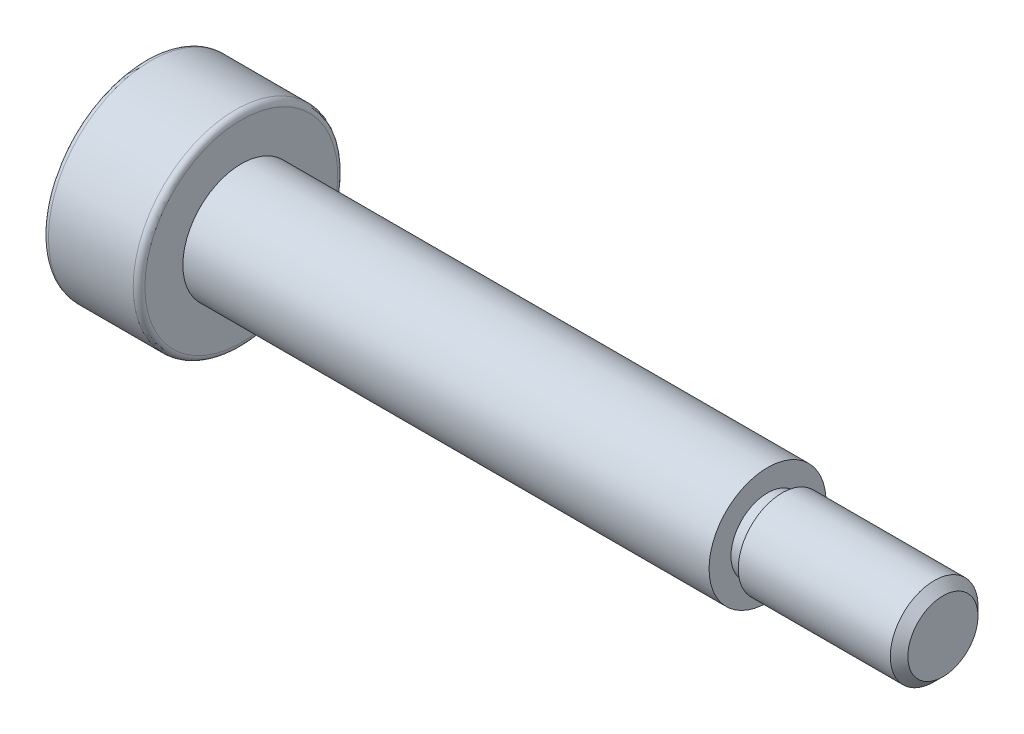
ISO-10303-21;
HEADER;
FILE_DESCRIPTION(('STEP AP214'),'2;1');
FILE_NAME('part.step','',(''),(''),'','','');
FILE_SCHEMA(('AUTOMOTIVE_DESIGN { 1 0 10303 214 1 1 1 1 }'));
ENDSEC;
DATA;
#1=APPLICATION_CONTEXT('core data for automotive mechanical design processes');
#2=APPLICATION_PROTOCOL_DEFINITION('international standard','automotive_design',2000,#1);
#3=PRODUCT_CONTEXT('',#1,'mechanical');
#4=PRODUCT('Part','Part','',(#3));
#5=PRODUCT_RELATED_PRODUCT_CATEGORY('part','',(#4));
#6=PRODUCT_DEFINITION_FORMATION('','',#4);
#7=PRODUCT_DEFINITION_CONTEXT('part definition',#1,'design');
#8=PRODUCT_DEFINITION('design','',#6,#7);
#9=PRODUCT_DEFINITION_SHAPE('','',#8);
#10=(LENGTH_UNIT() NAMED_UNIT(*) SI_UNIT(.MILLI.,.METRE.));
#11=(NAMED_UNIT(*) PLANE_ANGLE_UNIT() SI_UNIT($,.RADIAN.));
#12=(NAMED_UNIT(*) SI_UNIT($,.STERADIAN.) SOLID_ANGLE_UNIT());
#13=UNCERTAINTY_MEASURE_WITH_UNIT(LENGTH_MEASURE(1.E-05),#10,'distance_accuracy_value','');
#14=(GEOMETRIC_REPRESENTATION_CONTEXT(3) GLOBAL_UNCERTAINTY_ASSIGNED_CONTEXT((#13)) GLOBAL_UNIT_ASSIGNED_CONTEXT((#10,
#11,#12)) REPRESENTATION_CONTEXT('',''));
#15=CARTESIAN_POINT('',(0.,0.,0.));
#16=DIRECTION('',(0.,0.,1.));
#17=DIRECTION('',(1.,0.,0.));
#18=AXIS2_PLACEMENT_3D('',#15,#16,#17);
#19=CARTESIAN_POINT('',(-13.65,0.,0.));
#20=DIRECTION('',(1.,0.,0.));
#21=DIRECTION('',(0.,0.,-1.));
#22=AXIS2_PLACEMENT_3D('',#19,#20,#21);
#23=PLANE('',#22);
#24=DIRECTION('',(0.,0.866025403784438,-0.5));
#25=VECTOR('',#24,1.);
#26=CARTESIAN_POINT('',(-13.65,0.,1.73205080756888));
#27=LINE('',#26,#25);
#28=CARTESIAN_POINT('',(-13.65,0.,1.73205080756888));
#29=VERTEX_POINT('',#28);
#30=CARTESIAN_POINT('',(-13.65,1.5,0.866025403784438));
#31=VERTEX_POINT('',#30);
#32=EDGE_CURVE('E127',#29,#31,#27,.T.);
#33=ORIENTED_EDGE('',*,*,#32,.F.);
#34=DIRECTION('',(0.,0.866025403784439,0.5));
#35=VECTOR('',#34,1.);
#36=CARTESIAN_POINT('',(-13.65,-1.5,0.866025403784438));
#37=LINE('',#36,#35);
#38=CARTESIAN_POINT('',(-13.65,-1.5,0.866025403784438));
#39=VERTEX_POINT('',#38);
#40=EDGE_CURVE('E53',#39,#29,#37,.T.);
#41=ORIENTED_EDGE('',*,*,#40,.F.);
#42=DIRECTION('',(0.,0.,1.));
#43=VECTOR('',#42,1.);
#44=CARTESIAN_POINT('',(-13.65,-1.5,-0.866025403784438));
#45=LINE('',#44,#43);
#46=CARTESIAN_POINT('',(-13.65,-1.5,-0.866025403784438));
#47=VERTEX_POINT('',#46);
#48=EDGE_CURVE('E136',#47,#39,#45,.T.);
#49=ORIENTED_EDGE('',*,*,#48,.F.);
#50=DIRECTION('',(0.,-0.866025403784438,0.5));
#51=VECTOR('',#50,1.);
#52=CARTESIAN_POINT('',(-13.65,0.,-1.73205080756888));
#53=LINE('',#52,#51);
#54=CARTESIAN_POINT('',(-13.65,0.,-1.73205080756888));
#55=VERTEX_POINT('',#54);
#56=EDGE_CURVE('E134',#55,#47,#53,.T.);
#57=ORIENTED_EDGE('',*,*,#56,.F.);
#58=DIRECTION('',(0.,-0.866025403784439,-0.5));
#59=VECTOR('',#58,1.);
#60=CARTESIAN_POINT('',(-13.65,1.5,-0.866025403784438));
#61=LINE('',#60,#59);
#62=CARTESIAN_POINT('',(-13.65,1.5,-0.866025403784438));
#63=VERTEX_POINT('',#62);
#64=EDGE_CURVE('E101',#63,#55,#61,.T.);
#65=ORIENTED_EDGE('',*,*,#64,.F.);
#66=DIRECTION('',(0.,0.,-1.));
#67=VECTOR('',#66,1.);
#68=CARTESIAN_POINT('',(-13.65,1.5,0.866025403784438));
#69=LINE('',#68,#67);
#70=EDGE_CURVE('E130',#31,#63,#69,.T.);
#71=ORIENTED_EDGE('',*,*,#70,.F.);
#72=EDGE_LOOP('',(#33,#41,#49,#57,#65,#71));
#73=FACE_BOUND('',#72,.T.);
#74=CARTESIAN_POINT('',(-13.65,0.,0.));
#75=DIRECTION('',(1.,0.,0.));
#76=DIRECTION('',(0.,0.,-1.));
#77=AXIS2_PLACEMENT_3D('',#74,#75,#76);
#78=CIRCLE('',#77,3.3);
#79=CARTESIAN_POINT('',(-13.65,0.,-3.3));
#80=VERTEX_POINT('',#79);
#81=EDGE_CURVE('E169',#80,#80,#78,.F.);
#82=ORIENTED_EDGE('',*,*,#81,.T.);
#83=EDGE_LOOP('',(#82));
#84=FACE_BOUND('',#83,.T.);
#85=ADVANCED_FACE('F37',(#73,#84),#23,.F.);
#86=CARTESIAN_POINT('',(-13.65,0.,0.));
#87=DIRECTION('',(-1.,0.,0.));
#88=DIRECTION('',(0.,0.,1.));
#89=AXIS2_PLACEMENT_3D('',#86,#87,#88);
#90=CYLINDRICAL_SURFACE('',#89,3.5);
#91=CARTESIAN_POINT('',(-10.55,0.,0.));
#92=DIRECTION('',(-1.,0.,0.));
#93=DIRECTION('',(0.,0.,1.));
#94=AXIS2_PLACEMENT_3D('',#91,#92,#93);
#95=CIRCLE('',#94,3.5);
#96=CARTESIAN_POINT('',(-10.55,0.,3.5));
#97=VERTEX_POINT('',#96);
#98=EDGE_CURVE('E163',#97,#97,#95,.T.);
#99=ORIENTED_EDGE('',*,*,#98,.T.);
#100=EDGE_LOOP('',(#99));
#101=FACE_BOUND('',#100,.T.);
#102=CARTESIAN_POINT('',(-13.45,0.,0.));
#103=DIRECTION('',(1.,0.,0.));
#104=DIRECTION('',(0.,0.,-1.));
#105=AXIS2_PLACEMENT_3D('',#102,#103,#104);
#106=CIRCLE('',#105,3.5);
#107=CARTESIAN_POINT('',(-13.45,0.,-3.5));
#108=VERTEX_POINT('',#107);
#109=EDGE_CURVE('E160',#108,#108,#106,.T.);
#110=ORIENTED_EDGE('',*,*,#109,.T.);
#111=EDGE_LOOP('',(#110));
#112=FACE_BOUND('',#111,.T.);
#113=ADVANCED_FACE('F191',(#101,#112),#90,.T.);
#114=CARTESIAN_POINT('',(-10.35,3.5,0.));
#115=DIRECTION('',(-1.,0.,0.));
#116=DIRECTION('',(0.,0.,1.));
#117=AXIS2_PLACEMENT_3D('',#114,#115,#116);
#118=PLANE('',#117);
#119=CARTESIAN_POINT('',(-10.35,0.,0.));
#120=DIRECTION('',(-1.,0.,0.));
#121=DIRECTION('',(0.,0.,1.));
#122=AXIS2_PLACEMENT_3D('',#119,#120,#121);
#123=CIRCLE('',#122,3.3);
#124=CARTESIAN_POINT('',(-10.35,0.,3.3));
#125=VERTEX_POINT('',#124);
#126=EDGE_CURVE('E166',#125,#125,#123,.F.);
#127=ORIENTED_EDGE('',*,*,#126,.T.);
#128=EDGE_LOOP('',(#127));
#129=FACE_BOUND('',#128,.T.);
#130=CARTESIAN_POINT('',(-10.35,0.,0.));
#131=DIRECTION('',(-1.,0.,0.));
#132=DIRECTION('',(0.,0.,1.));
#133=AXIS2_PLACEMENT_3D('',#130,#131,#132);
#134=CIRCLE('',#133,2.);
#135=CARTESIAN_POINT('',(-10.35,0.,2.));
#136=VERTEX_POINT('',#135);
#137=EDGE_CURVE('E157',#136,#136,#134,.T.);
#138=ORIENTED_EDGE('',*,*,#137,.T.);
#139=EDGE_LOOP('',(#138));
#140=FACE_BOUND('',#139,.T.);
#141=ADVANCED_FACE('F197',(#129,#140),#118,.F.);
#142=CARTESIAN_POINT('',(-13.65,0.,0.));
#143=DIRECTION('',(-1.,0.,0.));
#144=DIRECTION('',(0.,0.,1.));
#145=AXIS2_PLACEMENT_3D('',#142,#143,#144);
#146=CYLINDRICAL_SURFACE('',#145,2.);
#147=ORIENTED_EDGE('',*,*,#137,.F.);
#148=EDGE_LOOP('',(#147));
#149=FACE_BOUND('',#148,.T.);
#150=CARTESIAN_POINT('',(7.65,0.,0.));
#151=DIRECTION('',(-1.,0.,0.));
#152=DIRECTION('',(0.,0.,1.));
#153=AXIS2_PLACEMENT_3D('',#150,#151,#152);
#154=CIRCLE('',#153,2.);
#155=CARTESIAN_POINT('',(7.65,0.,2.));
#156=VERTEX_POINT('',#155);
#157=EDGE_CURVE('E154',#156,#156,#154,.T.);
#158=ORIENTED_EDGE('',*,*,#157,.T.);
#159=EDGE_LOOP('',(#158));
#160=FACE_BOUND('',#159,.T.);
#161=ADVANCED_FACE('F231',(#149,#160),#146,.T.);
#162=CARTESIAN_POINT('',(7.65,2.,0.));
#163=DIRECTION('',(-1.,0.,0.));
#164=DIRECTION('',(0.,0.,1.));
#165=AXIS2_PLACEMENT_3D('',#162,#163,#164);
#166=PLANE('',#165);
#167=ORIENTED_EDGE('',*,*,#157,.F.);
#168=EDGE_LOOP('',(#167));
#169=FACE_BOUND('',#168,.T.);
#170=CARTESIAN_POINT('',(7.65,0.,0.));
#171=DIRECTION('',(-1.,0.,0.));
#172=DIRECTION('',(0.,0.,1.));
#173=AXIS2_PLACEMENT_3D('',#170,#171,#172);
#174=CIRCLE('',#173,1.25);
#175=CARTESIAN_POINT('',(7.65,0.,1.25));
#176=VERTEX_POINT('',#175);
#177=EDGE_CURVE('E151',#176,#176,#174,.T.);
#178=ORIENTED_EDGE('',*,*,#177,.T.);
#179=EDGE_LOOP('',(#178));
#180=FACE_BOUND('',#179,.T.);
#181=ADVANCED_FACE('F207',(#169,#180),#166,.F.);
#182=CARTESIAN_POINT('',(-10.55,0.,0.));
#183=DIRECTION('',(-1.,0.,0.));
#184=DIRECTION('',(0.,0.,1.));
#185=AXIS2_PLACEMENT_3D('',#182,#183,#184);
#186=TOROIDAL_SURFACE('',#185,3.3,0.2);
#187=ORIENTED_EDGE('',*,*,#126,.F.);
#188=EDGE_LOOP('',(#187));
#189=FACE_BOUND('',#188,.T.);
#190=ORIENTED_EDGE('',*,*,#98,.F.);
#191=EDGE_LOOP('',(#190));
#192=FACE_BOUND('',#191,.T.);
#193=ADVANCED_FACE('F204',(#189,#192),#186,.T.);
#194=CARTESIAN_POINT('',(-13.45,0.,0.));
#195=DIRECTION('',(1.,0.,0.));
#196=DIRECTION('',(0.,0.,-1.));
#197=AXIS2_PLACEMENT_3D('',#194,#195,#196);
#198=TOROIDAL_SURFACE('',#197,3.3,0.2);
#199=ORIENTED_EDGE('',*,*,#109,.F.);
#200=EDGE_LOOP('',(#199));
#201=FACE_BOUND('',#200,.T.);
#202=ORIENTED_EDGE('',*,*,#81,.F.);
#203=EDGE_LOOP('',(#202));
#204=FACE_BOUND('',#203,.T.);
#205=ADVANCED_FACE('F206',(#201,#204),#198,.T.);
#206=CARTESIAN_POINT('',(7.65,0.,0.));
#207=DIRECTION('',(-1.,0.,0.));
#208=DIRECTION('',(0.,0.,1.));
#209=AXIS2_PLACEMENT_3D('',#206,#207,#208);
#210=CYLINDRICAL_SURFACE('',#209,1.25);
#211=CARTESIAN_POINT('',(8.15,0.,0.));
#212=DIRECTION('',(-1.,0.,0.));
#213=DIRECTION('',(0.,0.,1.));
#214=AXIS2_PLACEMENT_3D('',#211,#212,#213);
#215=CIRCLE('',#214,1.25);
#216=CARTESIAN_POINT('',(8.15,0.,1.25));
#217=VERTEX_POINT('',#216);
#218=EDGE_CURVE('E148',#217,#217,#215,.T.);
#219=ORIENTED_EDGE('',*,*,#218,.T.);
#220=EDGE_LOOP('',(#219));
#221=FACE_BOUND('',#220,.T.);
#222=ORIENTED_EDGE('',*,*,#177,.F.);
#223=EDGE_LOOP('',(#222));
#224=FACE_BOUND('',#223,.T.);
#225=ADVANCED_FACE('F210',(#221,#224),#210,.T.);
#226=CARTESIAN_POINT('',(8.15,1.5,0.));
#227=DIRECTION('',(-1.,0.,0.));
#228=DIRECTION('',(0.,0.,1.));
#229=AXIS2_PLACEMENT_3D('',#226,#227,#228);
#230=PLANE('',#229);
#231=CARTESIAN_POINT('',(8.15,0.,0.));
#232=DIRECTION('',(-1.,0.,0.));
#233=DIRECTION('',(0.,0.,1.));
#234=AXIS2_PLACEMENT_3D('',#231,#232,#233);
#235=CIRCLE('',#234,1.5);
#236=CARTESIAN_POINT('',(8.15,0.,1.5));
#237=VERTEX_POINT('',#236);
#238=EDGE_CURVE('E140',#237,#237,#235,.T.);
#239=ORIENTED_EDGE('',*,*,#238,.T.);
#240=EDGE_LOOP('',(#239));
#241=FACE_BOUND('',#240,.T.);
#242=ORIENTED_EDGE('',*,*,#218,.F.);
#243=EDGE_LOOP('',(#242));
#244=FACE_BOUND('',#243,.T.);
#245=ADVANCED_FACE('F186',(#241,#244),#230,.T.);
#246=CARTESIAN_POINT('',(13.65,1.5,0.));
#247=DIRECTION('',(-1.,0.,0.));
#248=DIRECTION('',(0.,0.,1.));
#249=AXIS2_PLACEMENT_3D('',#246,#247,#248);
#250=PLANE('',#249);
#251=CARTESIAN_POINT('',(13.65,0.,0.));
#252=DIRECTION('',(-1.,0.,0.));
#253=DIRECTION('',(0.,0.,1.));
#254=AXIS2_PLACEMENT_3D('',#251,#252,#253);
#255=CIRCLE('',#254,1.2);
#256=CARTESIAN_POINT('',(13.65,0.,1.2));
#257=VERTEX_POINT('',#256);
#258=EDGE_CURVE('E11',#257,#257,#255,.F.);
#259=ORIENTED_EDGE('',*,*,#258,.T.);
#260=EDGE_LOOP('',(#259));
#261=FACE_BOUND('',#260,.T.);
#262=ADVANCED_FACE('F178',(#261),#250,.F.);
#263=CARTESIAN_POINT('',(13.35,0.,0.));
#264=DIRECTION('',(-1.,0.,0.));
#265=DIRECTION('',(0.,0.,1.));
#266=AXIS2_PLACEMENT_3D('',#263,#264,#265);
#267=CONICAL_SURFACE('',#266,1.5,0.785398163397452);
#268=ORIENTED_EDGE('',*,*,#258,.F.);
#269=EDGE_LOOP('',(#268));
#270=FACE_BOUND('',#269,.T.);
#271=CARTESIAN_POINT('',(13.35,0.,0.));
#272=DIRECTION('',(-1.,0.,0.));
#273=DIRECTION('',(0.,0.,1.));
#274=AXIS2_PLACEMENT_3D('',#271,#272,#273);
#275=CIRCLE('',#274,1.5);
#276=CARTESIAN_POINT('',(13.35,0.,1.5));
#277=VERTEX_POINT('',#276);
#278=EDGE_CURVE('E46',#277,#277,#275,.T.);
#279=ORIENTED_EDGE('',*,*,#278,.F.);
#280=EDGE_LOOP('',(#279));
#281=FACE_BOUND('',#280,.T.);
#282=ADVANCED_FACE('F40',(#270,#281),#267,.T.);
#283=CARTESIAN_POINT('',(-13.65,0.,0.));
#284=DIRECTION('',(-1.,0.,0.));
#285=DIRECTION('',(0.,0.,1.));
#286=AXIS2_PLACEMENT_3D('',#283,#284,#285);
#287=CYLINDRICAL_SURFACE('',#286,1.5);
#288=ORIENTED_EDGE('',*,*,#278,.T.);
#289=EDGE_LOOP('',(#288));
#290=FACE_BOUND('',#289,.T.);
#291=ORIENTED_EDGE('',*,*,#238,.F.);
#292=EDGE_LOOP('',(#291));
#293=FACE_BOUND('',#292,.T.);
#294=ADVANCED_FACE('F174',(#290,#293),#287,.T.);
#295=CARTESIAN_POINT('',(-11.65,-1.5,0.866025403784438));
#296=DIRECTION('',(0.,-0.5,0.866025403784439));
#297=DIRECTION('',(0.,-0.866025403784439,-0.5));
#298=AXIS2_PLACEMENT_3D('',#295,#296,#297);
#299=PLANE('',#298);
#300=ORIENTED_EDGE('',*,*,#40,.T.);
#301=DIRECTION('',(-1.,0.,0.));
#302=VECTOR('',#301,1.);
#303=CARTESIAN_POINT('',(-11.65,0.,1.73205080756888));
#304=LINE('',#303,#302);
#305=CARTESIAN_POINT('',(-11.65,0.,1.73205080756888));
#306=VERTEX_POINT('',#305);
#307=EDGE_CURVE('E83',#306,#29,#304,.T.);
#308=ORIENTED_EDGE('',*,*,#307,.F.);
#309=DIRECTION('',(0.,0.866025403784439,0.5));
#310=VECTOR('',#309,1.);
#311=CARTESIAN_POINT('',(-11.65,-1.5,0.866025403784438));
#312=LINE('',#311,#310);
#313=CARTESIAN_POINT('',(-11.65,-1.5,0.866025403784438));
#314=VERTEX_POINT('',#313);
#315=EDGE_CURVE('E138',#314,#306,#312,.T.);
#316=ORIENTED_EDGE('',*,*,#315,.F.);
#317=DIRECTION('',(-1.,0.,0.));
#318=VECTOR('',#317,1.);
#319=CARTESIAN_POINT('',(-11.65,-1.5,0.866025403784438));
#320=LINE('',#319,#318);
#321=EDGE_CURVE('E61',#314,#39,#320,.T.);
#322=ORIENTED_EDGE('',*,*,#321,.T.);
#323=EDGE_LOOP('',(#300,#308,#316,#322));
#324=FACE_BOUND('',#323,.T.);
#325=ADVANCED_FACE('F184',(#324),#299,.F.);
#326=CARTESIAN_POINT('',(-11.65,-1.5,-0.866025403784438));
#327=DIRECTION('',(0.,-1.,0.));
#328=DIRECTION('',(0.,0.,-1.));
#329=AXIS2_PLACEMENT_3D('',#326,#327,#328);
#330=PLANE('',#329);
#331=ORIENTED_EDGE('',*,*,#48,.T.);
#332=ORIENTED_EDGE('',*,*,#321,.F.);
#333=DIRECTION('',(0.,0.,1.));
#334=VECTOR('',#333,1.);
#335=CARTESIAN_POINT('',(-11.65,-1.5,-0.866025403784438));
#336=LINE('',#335,#334);
#337=CARTESIAN_POINT('',(-11.65,-1.5,-0.866025403784438));
#338=VERTEX_POINT('',#337);
#339=EDGE_CURVE('E113',#338,#314,#336,.T.);
#340=ORIENTED_EDGE('',*,*,#339,.F.);
#341=DIRECTION('',(-1.,0.,0.));
#342=VECTOR('',#341,1.);
#343=CARTESIAN_POINT('',(-11.65,-1.5,-0.866025403784438));
#344=LINE('',#343,#342);
#345=EDGE_CURVE('E105',#338,#47,#344,.T.);
#346=ORIENTED_EDGE('',*,*,#345,.T.);
#347=EDGE_LOOP('',(#331,#332,#340,#346));
#348=FACE_BOUND('',#347,.T.);
#349=ADVANCED_FACE('F305',(#348),#330,.F.);
#350=CARTESIAN_POINT('',(-11.65,0.,-1.73205080756888));
#351=DIRECTION('',(0.,-0.5,-0.866025403784438));
#352=DIRECTION('',(0.,0.866025403784439,-0.5));
#353=AXIS2_PLACEMENT_3D('',#350,#351,#352);
#354=PLANE('',#353);
#355=ORIENTED_EDGE('',*,*,#56,.T.);
#356=ORIENTED_EDGE('',*,*,#345,.F.);
#357=DIRECTION('',(0.,-0.866025403784438,0.5));
#358=VECTOR('',#357,1.);
#359=CARTESIAN_POINT('',(-11.65,0.,-1.73205080756888));
#360=LINE('',#359,#358);
#361=CARTESIAN_POINT('',(-11.65,0.,-1.73205080756888));
#362=VERTEX_POINT('',#361);
#363=EDGE_CURVE('E109',#362,#338,#360,.T.);
#364=ORIENTED_EDGE('',*,*,#363,.F.);
#365=DIRECTION('',(-1.,0.,0.));
#366=VECTOR('',#365,1.);
#367=CARTESIAN_POINT('',(-11.65,0.,-1.73205080756888));
#368=LINE('',#367,#366);
#369=EDGE_CURVE('E94',#362,#55,#368,.T.);
#370=ORIENTED_EDGE('',*,*,#369,.T.);
#371=EDGE_LOOP('',(#355,#356,#364,#370));
#372=FACE_BOUND('',#371,.T.);
#373=ADVANCED_FACE('F110',(#372),#354,.F.);
#374=CARTESIAN_POINT('',(-11.65,1.5,-0.866025403784438));
#375=DIRECTION('',(0.,0.5,-0.866025403784439));
#376=DIRECTION('',(0.,0.866025403784439,0.5));
#377=AXIS2_PLACEMENT_3D('',#374,#375,#376);
#378=PLANE('',#377);
#379=ORIENTED_EDGE('',*,*,#64,.T.);
#380=ORIENTED_EDGE('',*,*,#369,.F.);
#381=DIRECTION('',(0.,-0.866025403784439,-0.5));
#382=VECTOR('',#381,1.);
#383=CARTESIAN_POINT('',(-11.65,1.5,-0.866025403784438));
#384=LINE('',#383,#382);
#385=CARTESIAN_POINT('',(-11.65,1.5,-0.866025403784438));
#386=VERTEX_POINT('',#385);
#387=EDGE_CURVE('E98',#386,#362,#384,.T.);
#388=ORIENTED_EDGE('',*,*,#387,.F.);
#389=DIRECTION('',(-1.,0.,0.));
#390=VECTOR('',#389,1.);
#391=CARTESIAN_POINT('',(-11.65,1.5,-0.866025403784438));
#392=LINE('',#391,#390);
#393=EDGE_CURVE('E106',#386,#63,#392,.T.);
#394=ORIENTED_EDGE('',*,*,#393,.T.);
#395=EDGE_LOOP('',(#379,#380,#388,#394));
#396=FACE_BOUND('',#395,.T.);
#397=ADVANCED_FACE('F96',(#396),#378,.F.);
#398=CARTESIAN_POINT('',(-11.65,1.5,0.866025403784438));
#399=DIRECTION('',(0.,1.,0.));
#400=DIRECTION('',(0.,0.,1.));
#401=AXIS2_PLACEMENT_3D('',#398,#399,#400);
#402=PLANE('',#401);
#403=ORIENTED_EDGE('',*,*,#70,.T.);
#404=ORIENTED_EDGE('',*,*,#393,.F.);
#405=DIRECTION('',(0.,0.,-1.));
#406=VECTOR('',#405,1.);
#407=CARTESIAN_POINT('',(-11.65,1.5,0.866025403784438));
#408=LINE('',#407,#406);
#409=CARTESIAN_POINT('',(-11.65,1.5,0.866025403784438));
#410=VERTEX_POINT('',#409);
#411=EDGE_CURVE('E119',#410,#386,#408,.T.);
#412=ORIENTED_EDGE('',*,*,#411,.F.);
#413=DIRECTION('',(-1.,0.,0.));
#414=VECTOR('',#413,1.);
#415=CARTESIAN_POINT('',(-11.65,1.5,0.866025403784438));
#416=LINE('',#415,#414);
#417=EDGE_CURVE('E143',#410,#31,#416,.T.);
#418=ORIENTED_EDGE('',*,*,#417,.T.);
#419=EDGE_LOOP('',(#403,#404,#412,#418));
#420=FACE_BOUND('',#419,.T.);
#421=ADVANCED_FACE('F326',(#420),#402,.F.);
#422=CARTESIAN_POINT('',(-11.65,0.,1.73205080756888));
#423=DIRECTION('',(0.,0.5,0.866025403784438));
#424=DIRECTION('',(0.,-0.866025403784439,0.5));
#425=AXIS2_PLACEMENT_3D('',#422,#423,#424);
#426=PLANE('',#425);
#427=ORIENTED_EDGE('',*,*,#32,.T.);
#428=ORIENTED_EDGE('',*,*,#417,.F.);
#429=DIRECTION('',(0.,0.866025403784438,-0.5));
#430=VECTOR('',#429,1.);
#431=CARTESIAN_POINT('',(-11.65,0.,1.73205080756888));
#432=LINE('',#431,#430);
#433=EDGE_CURVE('E121',#306,#410,#432,.T.);
#434=ORIENTED_EDGE('',*,*,#433,.F.);
#435=ORIENTED_EDGE('',*,*,#307,.T.);
#436=EDGE_LOOP('',(#427,#428,#434,#435));
#437=FACE_BOUND('',#436,.T.);
#438=ADVANCED_FACE('F334',(#437),#426,.F.);
#439=CARTESIAN_POINT('',(-11.65,0.,0.));
#440=DIRECTION('',(-1.,0.,0.));
#441=DIRECTION('',(0.,0.,1.));
#442=AXIS2_PLACEMENT_3D('',#439,#440,#441);
#443=PLANE('',#442);
#444=ORIENTED_EDGE('',*,*,#315,.T.);
#445=ORIENTED_EDGE('',*,*,#433,.T.);
#446=ORIENTED_EDGE('',*,*,#411,.T.);
#447=ORIENTED_EDGE('',*,*,#387,.T.);
#448=ORIENTED_EDGE('',*,*,#363,.T.);
#449=ORIENTED_EDGE('',*,*,#339,.T.);
#450=EDGE_LOOP('',(#444,#445,#446,#447,#448,#449));
#451=FACE_BOUND('',#450,.T.);
#452=ADVANCED_FACE('F116',(#451),#443,.T.);
#453=CLOSED_SHELL('',(#85,#113,#141,#161,#181,#193,#205,#225,#245,#262,#282,#294,#325,#349,#373,
#397,#421,#438,#452));
#454=MANIFOLD_SOLID_BREP('B2',#453);
#455=ADVANCED_BREP_SHAPE_REPRESENTATION('',(#18,#454),#14);
#456=SHAPE_DEFINITION_REPRESENTATION(#9,#455);
ENDSEC;
END-ISO-10303-21;
